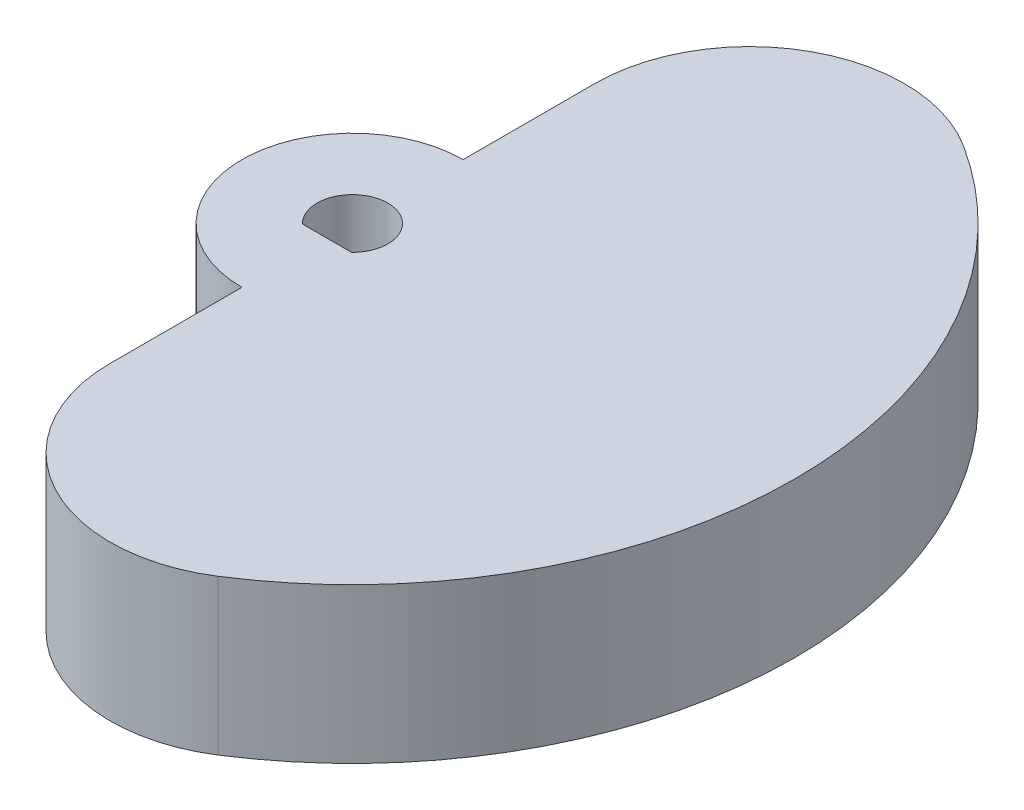
ISO-10303-21;
HEADER;
FILE_DESCRIPTION(('STEP AP214'),'2;1');
FILE_NAME('part.step','',(''),(''),'','','');
FILE_SCHEMA(('AUTOMOTIVE_DESIGN { 1 0 10303 214 1 1 1 1 }'));
ENDSEC;
DATA;
#1=APPLICATION_CONTEXT('core data for automotive mechanical design processes');
#2=APPLICATION_PROTOCOL_DEFINITION('international standard','automotive_design',2000,#1);
#3=PRODUCT_CONTEXT('',#1,'mechanical');
#4=PRODUCT('Part','Part','',(#3));
#5=PRODUCT_RELATED_PRODUCT_CATEGORY('part','',(#4));
#6=PRODUCT_DEFINITION_FORMATION('','',#4);
#7=PRODUCT_DEFINITION_CONTEXT('part definition',#1,'design');
#8=PRODUCT_DEFINITION('design','',#6,#7);
#9=PRODUCT_DEFINITION_SHAPE('','',#8);
#10=(LENGTH_UNIT() NAMED_UNIT(*) SI_UNIT(.MILLI.,.METRE.));
#11=(NAMED_UNIT(*) PLANE_ANGLE_UNIT() SI_UNIT($,.RADIAN.));
#12=(NAMED_UNIT(*) SI_UNIT($,.STERADIAN.) SOLID_ANGLE_UNIT());
#13=UNCERTAINTY_MEASURE_WITH_UNIT(LENGTH_MEASURE(1.E-05),#10,'distance_accuracy_value','');
#14=(GEOMETRIC_REPRESENTATION_CONTEXT(3) GLOBAL_UNCERTAINTY_ASSIGNED_CONTEXT((#13)) GLOBAL_UNIT_ASSIGNED_CONTEXT((#10,
#11,#12)) REPRESENTATION_CONTEXT('',''));
#15=CARTESIAN_POINT('',(0.,0.,0.));
#16=DIRECTION('',(0.,0.,1.));
#17=DIRECTION('',(1.,0.,0.));
#18=AXIS2_PLACEMENT_3D('',#15,#16,#17);
#19=CARTESIAN_POINT('',(0.,7.,0.));
#20=DIRECTION('',(0.,1.,0.));
#21=DIRECTION('',(0.,0.,1.));
#22=AXIS2_PLACEMENT_3D('',#19,#20,#21);
#23=PLANE('',#22);
#24=CARTESIAN_POINT('',(0.,7.,0.));
#25=DIRECTION('',(0.,1.,0.));
#26=DIRECTION('',(0.,0.,1.));
#27=AXIS2_PLACEMENT_3D('',#24,#25,#26);
#28=CIRCLE('',#27,20.);
#29=CARTESIAN_POINT('',(10.7692307692308,7.,16.8530017693897));
#30=VERTEX_POINT('',#29);
#31=CARTESIAN_POINT('',(10.7692307692308,7.,-16.8530017693897));
#32=VERTEX_POINT('',#31);
#33=EDGE_CURVE('E132',#30,#32,#28,.T.);
#34=ORIENTED_EDGE('',*,*,#33,.T.);
#35=CARTESIAN_POINT('',(7.,7.,-10.9544511501033));
#36=DIRECTION('',(0.,1.,0.));
#37=DIRECTION('',(0.,0.,1.));
#38=AXIS2_PLACEMENT_3D('',#35,#36,#37);
#39=CIRCLE('',#38,7.);
#40=CARTESIAN_POINT('',(0.,7.,-10.9544511501033));
#41=VERTEX_POINT('',#40);
#42=EDGE_CURVE('E49',#32,#41,#39,.T.);
#43=ORIENTED_EDGE('',*,*,#42,.T.);
#44=DIRECTION('',(0.,0.,1.));
#45=VECTOR('',#44,1.);
#46=CARTESIAN_POINT('',(0.,7.,-20.));
#47=LINE('',#46,#45);
#48=CARTESIAN_POINT('',(0.,7.,-5.));
#49=VERTEX_POINT('',#48);
#50=EDGE_CURVE('E134',#41,#49,#47,.T.);
#51=ORIENTED_EDGE('',*,*,#50,.T.);
#52=CARTESIAN_POINT('',(0.,7.,0.));
#53=DIRECTION('',(0.,1.,0.));
#54=DIRECTION('',(0.,0.,1.));
#55=AXIS2_PLACEMENT_3D('',#52,#53,#54);
#56=CIRCLE('',#55,5.);
#57=CARTESIAN_POINT('',(0.,7.,5.));
#58=VERTEX_POINT('',#57);
#59=EDGE_CURVE('E137',#49,#58,#56,.T.);
#60=ORIENTED_EDGE('',*,*,#59,.T.);
#61=DIRECTION('',(0.,0.,1.));
#62=VECTOR('',#61,1.);
#63=CARTESIAN_POINT('',(0.,7.,5.));
#64=LINE('',#63,#62);
#65=CARTESIAN_POINT('',(0.,7.,10.9544511501033));
#66=VERTEX_POINT('',#65);
#67=EDGE_CURVE('E139',#58,#66,#64,.T.);
#68=ORIENTED_EDGE('',*,*,#67,.T.);
#69=CARTESIAN_POINT('',(7.,7.,10.9544511501033));
#70=DIRECTION('',(0.,1.,0.));
#71=DIRECTION('',(0.,0.,1.));
#72=AXIS2_PLACEMENT_3D('',#69,#70,#71);
#73=CIRCLE('',#72,7.);
#74=EDGE_CURVE('E164',#66,#30,#73,.T.);
#75=ORIENTED_EDGE('',*,*,#74,.T.);
#76=EDGE_LOOP('',(#34,#43,#51,#60,#68,#75));
#77=FACE_BOUND('',#76,.T.);
#78=DIRECTION('',(1.,0.,0.));
#79=VECTOR('',#78,1.);
#80=CARTESIAN_POINT('',(1.11242977306435,7.,1.15));
#81=LINE('',#80,#79);
#82=CARTESIAN_POINT('',(-1.11242977306435,7.,1.15));
#83=VERTEX_POINT('',#82);
#84=CARTESIAN_POINT('',(1.11242977306435,7.,1.15));
#85=VERTEX_POINT('',#84);
#86=EDGE_CURVE('E108',#83,#85,#81,.T.);
#87=ORIENTED_EDGE('',*,*,#86,.F.);
#88=CARTESIAN_POINT('',(0.,7.,0.));
#89=DIRECTION('',(0.,1.,0.));
#90=DIRECTION('',(0.,0.,1.));
#91=AXIS2_PLACEMENT_3D('',#88,#89,#90);
#92=CIRCLE('',#91,1.6);
#93=EDGE_CURVE('E118',#85,#83,#92,.T.);
#94=ORIENTED_EDGE('',*,*,#93,.F.);
#95=EDGE_LOOP('',(#87,#94));
#96=FACE_BOUND('',#95,.T.);
#97=ADVANCED_FACE('F41',(#77,#96),#23,.T.);
#98=CARTESIAN_POINT('',(0.,0.,0.));
#99=DIRECTION('',(0.,1.,0.));
#100=DIRECTION('',(0.,0.,1.));
#101=AXIS2_PLACEMENT_3D('',#98,#99,#100);
#102=PLANE('',#101);
#103=DIRECTION('',(0.,0.,1.));
#104=VECTOR('',#103,1.);
#105=CARTESIAN_POINT('',(0.,0.,-20.));
#106=LINE('',#105,#104);
#107=CARTESIAN_POINT('',(0.,0.,-10.9544511501033));
#108=VERTEX_POINT('',#107);
#109=CARTESIAN_POINT('',(0.,0.,-5.));
#110=VERTEX_POINT('',#109);
#111=EDGE_CURVE('E143',#108,#110,#106,.T.);
#112=ORIENTED_EDGE('',*,*,#111,.F.);
#113=CARTESIAN_POINT('',(7.,0.,-10.9544511501033));
#114=DIRECTION('',(0.,1.,0.));
#115=DIRECTION('',(0.,0.,1.));
#116=AXIS2_PLACEMENT_3D('',#113,#114,#115);
#117=CIRCLE('',#116,7.);
#118=CARTESIAN_POINT('',(10.7692307692308,0.,-16.8530017693897));
#119=VERTEX_POINT('',#118);
#120=EDGE_CURVE('E158',#108,#119,#117,.F.);
#121=ORIENTED_EDGE('',*,*,#120,.T.);
#122=CARTESIAN_POINT('',(0.,0.,0.));
#123=DIRECTION('',(0.,1.,0.));
#124=DIRECTION('',(0.,0.,1.));
#125=AXIS2_PLACEMENT_3D('',#122,#123,#124);
#126=CIRCLE('',#125,20.);
#127=CARTESIAN_POINT('',(10.7692307692308,0.,16.8530017693897));
#128=VERTEX_POINT('',#127);
#129=EDGE_CURVE('E131',#128,#119,#126,.T.);
#130=ORIENTED_EDGE('',*,*,#129,.F.);
#131=CARTESIAN_POINT('',(7.,0.,10.9544511501033));
#132=DIRECTION('',(0.,1.,0.));
#133=DIRECTION('',(0.,0.,1.));
#134=AXIS2_PLACEMENT_3D('',#131,#132,#133);
#135=CIRCLE('',#134,7.);
#136=CARTESIAN_POINT('',(0.,0.,10.9544511501033));
#137=VERTEX_POINT('',#136);
#138=EDGE_CURVE('E156',#128,#137,#135,.F.);
#139=ORIENTED_EDGE('',*,*,#138,.T.);
#140=DIRECTION('',(0.,0.,1.));
#141=VECTOR('',#140,1.);
#142=CARTESIAN_POINT('',(0.,0.,5.));
#143=LINE('',#142,#141);
#144=CARTESIAN_POINT('',(0.,0.,5.));
#145=VERTEX_POINT('',#144);
#146=EDGE_CURVE('E135',#145,#137,#143,.T.);
#147=ORIENTED_EDGE('',*,*,#146,.F.);
#148=CARTESIAN_POINT('',(0.,0.,0.));
#149=DIRECTION('',(0.,1.,0.));
#150=DIRECTION('',(0.,0.,1.));
#151=AXIS2_PLACEMENT_3D('',#148,#149,#150);
#152=CIRCLE('',#151,5.);
#153=EDGE_CURVE('E145',#110,#145,#152,.T.);
#154=ORIENTED_EDGE('',*,*,#153,.F.);
#155=EDGE_LOOP('',(#112,#121,#130,#139,#147,#154));
#156=FACE_BOUND('',#155,.T.);
#157=CARTESIAN_POINT('',(0.,0.,0.));
#158=DIRECTION('',(0.,1.,0.));
#159=DIRECTION('',(0.,0.,1.));
#160=AXIS2_PLACEMENT_3D('',#157,#158,#159);
#161=CIRCLE('',#160,1.6);
#162=CARTESIAN_POINT('',(1.11242977306435,0.,1.15));
#163=VERTEX_POINT('',#162);
#164=CARTESIAN_POINT('',(-1.11242977306435,0.,1.15));
#165=VERTEX_POINT('',#164);
#166=EDGE_CURVE('E123',#163,#165,#161,.T.);
#167=ORIENTED_EDGE('',*,*,#166,.T.);
#168=DIRECTION('',(1.,0.,0.));
#169=VECTOR('',#168,1.);
#170=CARTESIAN_POINT('',(1.11242977306435,0.,1.15));
#171=LINE('',#170,#169);
#172=EDGE_CURVE('E125',#165,#163,#171,.T.);
#173=ORIENTED_EDGE('',*,*,#172,.T.);
#174=EDGE_LOOP('',(#167,#173));
#175=FACE_BOUND('',#174,.T.);
#176=ADVANCED_FACE('F178',(#156,#175),#102,.F.);
#177=CARTESIAN_POINT('',(0.,7.,0.));
#178=DIRECTION('',(0.,-1.,0.));
#179=DIRECTION('',(0.,0.,-1.));
#180=AXIS2_PLACEMENT_3D('',#177,#178,#179);
#181=CYLINDRICAL_SURFACE('',#180,20.);
#182=ORIENTED_EDGE('',*,*,#129,.T.);
#183=DIRECTION('',(0.,-1.,0.));
#184=VECTOR('',#183,1.);
#185=CARTESIAN_POINT('',(10.7692307692308,7.,-16.8530017693897));
#186=LINE('',#185,#184);
#187=EDGE_CURVE('E62',#119,#32,#186,.F.);
#188=ORIENTED_EDGE('',*,*,#187,.T.);
#189=ORIENTED_EDGE('',*,*,#33,.F.);
#190=DIRECTION('',(0.,-1.,0.));
#191=VECTOR('',#190,1.);
#192=CARTESIAN_POINT('',(10.7692307692308,7.,16.8530017693897));
#193=LINE('',#192,#191);
#194=EDGE_CURVE('E160',#30,#128,#193,.T.);
#195=ORIENTED_EDGE('',*,*,#194,.T.);
#196=EDGE_LOOP('',(#182,#188,#189,#195));
#197=FACE_BOUND('',#196,.T.);
#198=ADVANCED_FACE('F181',(#197),#181,.T.);
#199=CARTESIAN_POINT('',(0.,7.,-20.));
#200=DIRECTION('',(1.,0.,0.));
#201=DIRECTION('',(0.,0.,-1.));
#202=AXIS2_PLACEMENT_3D('',#199,#200,#201);
#203=PLANE('',#202);
#204=ORIENTED_EDGE('',*,*,#50,.F.);
#205=DIRECTION('',(0.,-1.,0.));
#206=VECTOR('',#205,1.);
#207=CARTESIAN_POINT('',(0.,7.,-10.9544511501033));
#208=LINE('',#207,#206);
#209=EDGE_CURVE('E153',#41,#108,#208,.T.);
#210=ORIENTED_EDGE('',*,*,#209,.T.);
#211=ORIENTED_EDGE('',*,*,#111,.T.);
#212=DIRECTION('',(0.,-1.,0.));
#213=VECTOR('',#212,1.);
#214=CARTESIAN_POINT('',(0.,7.,-5.));
#215=LINE('',#214,#213);
#216=EDGE_CURVE('E150',#49,#110,#215,.T.);
#217=ORIENTED_EDGE('',*,*,#216,.F.);
#218=EDGE_LOOP('',(#204,#210,#211,#217));
#219=FACE_BOUND('',#218,.T.);
#220=ADVANCED_FACE('F172',(#219),#203,.F.);
#221=CARTESIAN_POINT('',(0.,7.,0.));
#222=DIRECTION('',(0.,-1.,0.));
#223=DIRECTION('',(0.,0.,-1.));
#224=AXIS2_PLACEMENT_3D('',#221,#222,#223);
#225=CYLINDRICAL_SURFACE('',#224,5.);
#226=ORIENTED_EDGE('',*,*,#153,.T.);
#227=DIRECTION('',(0.,-1.,0.));
#228=VECTOR('',#227,1.);
#229=CARTESIAN_POINT('',(0.,7.,5.));
#230=LINE('',#229,#228);
#231=EDGE_CURVE('E141',#58,#145,#230,.T.);
#232=ORIENTED_EDGE('',*,*,#231,.F.);
#233=ORIENTED_EDGE('',*,*,#59,.F.);
#234=ORIENTED_EDGE('',*,*,#216,.T.);
#235=EDGE_LOOP('',(#226,#232,#233,#234));
#236=FACE_BOUND('',#235,.T.);
#237=ADVANCED_FACE('F189',(#236),#225,.T.);
#238=CARTESIAN_POINT('',(0.,7.,5.));
#239=DIRECTION('',(1.,0.,0.));
#240=DIRECTION('',(0.,0.,-1.));
#241=AXIS2_PLACEMENT_3D('',#238,#239,#240);
#242=PLANE('',#241);
#243=ORIENTED_EDGE('',*,*,#146,.T.);
#244=DIRECTION('',(0.,-1.,0.));
#245=VECTOR('',#244,1.);
#246=CARTESIAN_POINT('',(0.,7.,10.9544511501033));
#247=LINE('',#246,#245);
#248=EDGE_CURVE('E11',#137,#66,#247,.F.);
#249=ORIENTED_EDGE('',*,*,#248,.T.);
#250=ORIENTED_EDGE('',*,*,#67,.F.);
#251=ORIENTED_EDGE('',*,*,#231,.T.);
#252=EDGE_LOOP('',(#243,#249,#250,#251));
#253=FACE_BOUND('',#252,.T.);
#254=ADVANCED_FACE('F186',(#253),#242,.F.);
#255=CARTESIAN_POINT('',(0.,7.,0.));
#256=DIRECTION('',(0.,-1.,0.));
#257=DIRECTION('',(0.,0.,-1.));
#258=AXIS2_PLACEMENT_3D('',#255,#256,#257);
#259=CYLINDRICAL_SURFACE('',#258,1.6);
#260=ORIENTED_EDGE('',*,*,#166,.F.);
#261=DIRECTION('',(0.,-1.,0.));
#262=VECTOR('',#261,1.);
#263=CARTESIAN_POINT('',(1.11242977306435,7.,1.15));
#264=LINE('',#263,#262);
#265=EDGE_CURVE('E111',#85,#163,#264,.T.);
#266=ORIENTED_EDGE('',*,*,#265,.F.);
#267=ORIENTED_EDGE('',*,*,#93,.T.);
#268=DIRECTION('',(0.,-1.,0.));
#269=VECTOR('',#268,1.);
#270=CARTESIAN_POINT('',(-1.11242977306435,7.,1.15));
#271=LINE('',#270,#269);
#272=EDGE_CURVE('E114',#83,#165,#271,.T.);
#273=ORIENTED_EDGE('',*,*,#272,.T.);
#274=EDGE_LOOP('',(#260,#266,#267,#273));
#275=FACE_BOUND('',#274,.T.);
#276=ADVANCED_FACE('F121',(#275),#259,.F.);
#277=CARTESIAN_POINT('',(1.11242977306435,7.,1.15));
#278=DIRECTION('',(0.,0.,-1.));
#279=DIRECTION('',(-1.,0.,0.));
#280=AXIS2_PLACEMENT_3D('',#277,#278,#279);
#281=PLANE('',#280);
#282=ORIENTED_EDGE('',*,*,#172,.F.);
#283=ORIENTED_EDGE('',*,*,#272,.F.);
#284=ORIENTED_EDGE('',*,*,#86,.T.);
#285=ORIENTED_EDGE('',*,*,#265,.T.);
#286=EDGE_LOOP('',(#282,#283,#284,#285));
#287=FACE_BOUND('',#286,.T.);
#288=ADVANCED_FACE('F110',(#287),#281,.T.);
#289=CARTESIAN_POINT('',(7.,7.,-10.9544511501033));
#290=DIRECTION('',(0.,-1.,0.));
#291=DIRECTION('',(0.,0.,-1.));
#292=AXIS2_PLACEMENT_3D('',#289,#290,#291);
#293=CYLINDRICAL_SURFACE('',#292,7.);
#294=ORIENTED_EDGE('',*,*,#42,.F.);
#295=ORIENTED_EDGE('',*,*,#187,.F.);
#296=ORIENTED_EDGE('',*,*,#120,.F.);
#297=ORIENTED_EDGE('',*,*,#209,.F.);
#298=EDGE_LOOP('',(#294,#295,#296,#297));
#299=FACE_BOUND('',#298,.T.);
#300=ADVANCED_FACE('F175',(#299),#293,.T.);
#301=CARTESIAN_POINT('',(7.,7.,10.9544511501033));
#302=DIRECTION('',(0.,-1.,0.));
#303=DIRECTION('',(0.,0.,-1.));
#304=AXIS2_PLACEMENT_3D('',#301,#302,#303);
#305=CYLINDRICAL_SURFACE('',#304,7.);
#306=ORIENTED_EDGE('',*,*,#74,.F.);
#307=ORIENTED_EDGE('',*,*,#248,.F.);
#308=ORIENTED_EDGE('',*,*,#138,.F.);
#309=ORIENTED_EDGE('',*,*,#194,.F.);
#310=EDGE_LOOP('',(#306,#307,#308,#309));
#311=FACE_BOUND('',#310,.T.);
#312=ADVANCED_FACE('F43',(#311),#305,.T.);
#313=CLOSED_SHELL('',(#97,#176,#198,#220,#237,#254,#276,#288,#300,#312));
#314=MANIFOLD_SOLID_BREP('B2',#313);
#315=ADVANCED_BREP_SHAPE_REPRESENTATION('',(#18,#314),#14);
#316=SHAPE_DEFINITION_REPRESENTATION(#9,#315);
ENDSEC;
END-ISO-10303-21;
